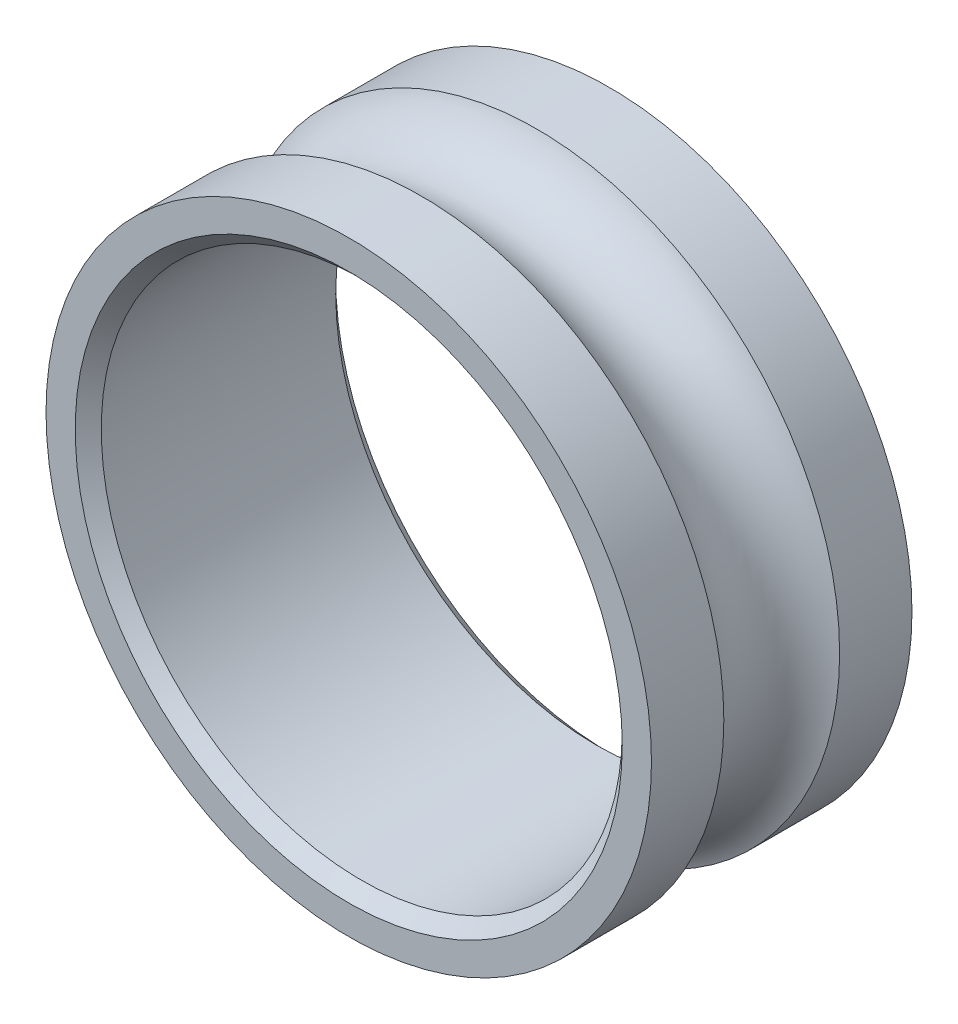
ISO-10303-21;
HEADER;
FILE_DESCRIPTION(('STEP AP214'),'2;1');
FILE_NAME('part.step','',(''),(''),'','','');
FILE_SCHEMA(('AUTOMOTIVE_DESIGN { 1 0 10303 214 1 1 1 1 }'));
ENDSEC;
DATA;
#1=APPLICATION_CONTEXT('core data for automotive mechanical design processes');
#2=APPLICATION_PROTOCOL_DEFINITION('international standard','automotive_design',2000,#1);
#3=PRODUCT_CONTEXT('',#1,'mechanical');
#4=PRODUCT('Part','Part','',(#3));
#5=PRODUCT_RELATED_PRODUCT_CATEGORY('part','',(#4));
#6=PRODUCT_DEFINITION_FORMATION('','',#4);
#7=PRODUCT_DEFINITION_CONTEXT('part definition',#1,'design');
#8=PRODUCT_DEFINITION('design','',#6,#7);
#9=PRODUCT_DEFINITION_SHAPE('','',#8);
#10=(LENGTH_UNIT() NAMED_UNIT(*) SI_UNIT(.MILLI.,.METRE.));
#11=(NAMED_UNIT(*) PLANE_ANGLE_UNIT() SI_UNIT($,.RADIAN.));
#12=(NAMED_UNIT(*) SI_UNIT($,.STERADIAN.) SOLID_ANGLE_UNIT());
#13=UNCERTAINTY_MEASURE_WITH_UNIT(LENGTH_MEASURE(1.E-05),#10,'distance_accuracy_value','');
#14=(GEOMETRIC_REPRESENTATION_CONTEXT(3) GLOBAL_UNCERTAINTY_ASSIGNED_CONTEXT((#13)) GLOBAL_UNIT_ASSIGNED_CONTEXT((#10,
#11,#12)) REPRESENTATION_CONTEXT('',''));
#15=CARTESIAN_POINT('',(0.,0.,0.));
#16=DIRECTION('',(0.,0.,1.));
#17=DIRECTION('',(1.,0.,0.));
#18=AXIS2_PLACEMENT_3D('',#15,#16,#17);
#19=CARTESIAN_POINT('',(0.,0.,0.));
#20=DIRECTION('',(0.,0.,1.));
#21=DIRECTION('',(1.,0.,0.));
#22=AXIS2_PLACEMENT_3D('',#19,#20,#21);
#23=TOROIDAL_SURFACE('',#22,3.96875,0.758760243513403);
#24=CARTESIAN_POINT('',(0.,0.,0.705555555555556));
#25=DIRECTION('',(0.,0.,1.));
#26=DIRECTION('',(1.,0.,0.));
#27=AXIS2_PLACEMENT_3D('',#24,#25,#26);
#28=CIRCLE('',#27,3.68962912087912);
#29=CARTESIAN_POINT('',(3.68962912087912,0.,0.705555555555556));
#30=VERTEX_POINT('',#29);
#31=EDGE_CURVE('E33',#30,#30,#28,.T.);
#32=ORIENTED_EDGE('',*,*,#31,.F.);
#33=EDGE_LOOP('',(#32));
#34=FACE_BOUND('',#33,.T.);
#35=CARTESIAN_POINT('',(0.,0.,-0.705555555555556));
#36=DIRECTION('',(0.,0.,1.));
#37=DIRECTION('',(1.,0.,0.));
#38=AXIS2_PLACEMENT_3D('',#35,#36,#37);
#39=CIRCLE('',#38,3.68962912087912);
#40=CARTESIAN_POINT('',(3.68962912087912,0.,-0.705555555555556));
#41=VERTEX_POINT('',#40);
#42=EDGE_CURVE('E31',#41,#41,#39,.F.);
#43=ORIENTED_EDGE('',*,*,#42,.F.);
#44=EDGE_LOOP('',(#43));
#45=FACE_BOUND('',#44,.T.);
#46=ADVANCED_FACE('F15',(#34,#45),#23,.F.);
#47=CARTESIAN_POINT('',(0.,0.,1.5875));
#48=DIRECTION('',(0.,0.,1.));
#49=DIRECTION('',(1.,0.,0.));
#50=AXIS2_PLACEMENT_3D('',#47,#48,#49);
#51=CYLINDRICAL_SURFACE('',#50,3.68962912087912);
#52=CARTESIAN_POINT('',(0.,0.,1.5875));
#53=DIRECTION('',(0.,0.,1.));
#54=DIRECTION('',(1.,0.,0.));
#55=AXIS2_PLACEMENT_3D('',#52,#53,#54);
#56=CIRCLE('',#55,3.68962912087912);
#57=CARTESIAN_POINT('',(3.68962912087912,0.,1.5875));
#58=VERTEX_POINT('',#57);
#59=EDGE_CURVE('E19',#58,#58,#56,.F.);
#60=ORIENTED_EDGE('',*,*,#59,.T.);
#61=EDGE_LOOP('',(#60));
#62=FACE_BOUND('',#61,.T.);
#63=ORIENTED_EDGE('',*,*,#31,.T.);
#64=EDGE_LOOP('',(#63));
#65=FACE_BOUND('',#64,.T.);
#66=ADVANCED_FACE('F49',(#62,#65),#51,.T.);
#67=CARTESIAN_POINT('',(0.,0.,1.5875));
#68=DIRECTION('',(0.,0.,1.));
#69=DIRECTION('',(1.,0.,0.));
#70=AXIS2_PLACEMENT_3D('',#67,#68,#69);
#71=CYLINDRICAL_SURFACE('',#70,3.68962912087912);
#72=ORIENTED_EDGE('',*,*,#42,.T.);
#73=EDGE_LOOP('',(#72));
#74=FACE_BOUND('',#73,.T.);
#75=CARTESIAN_POINT('',(0.,0.,-1.5875));
#76=DIRECTION('',(0.,0.,1.));
#77=DIRECTION('',(1.,0.,0.));
#78=AXIS2_PLACEMENT_3D('',#75,#76,#77);
#79=CIRCLE('',#78,3.68962912087912);
#80=CARTESIAN_POINT('',(3.68962912087912,0.,-1.5875));
#81=VERTEX_POINT('',#80);
#82=EDGE_CURVE('E42',#81,#81,#79,.T.);
#83=ORIENTED_EDGE('',*,*,#82,.T.);
#84=EDGE_LOOP('',(#83));
#85=FACE_BOUND('',#84,.T.);
#86=ADVANCED_FACE('F56',(#74,#85),#71,.T.);
#87=CARTESIAN_POINT('',(0.,3.68962912087912,1.5875));
#88=DIRECTION('',(0.,0.,-1.));
#89=DIRECTION('',(-1.,0.,0.));
#90=AXIS2_PLACEMENT_3D('',#87,#88,#89);
#91=PLANE('',#90);
#92=ORIENTED_EDGE('',*,*,#59,.F.);
#93=EDGE_LOOP('',(#92));
#94=FACE_BOUND('',#93,.T.);
#95=CARTESIAN_POINT('',(0.,0.,1.58750000002783));
#96=DIRECTION('',(0.,0.,1.));
#97=DIRECTION('',(1.,0.,0.));
#98=AXIS2_PLACEMENT_3D('',#95,#96,#97);
#99=CIRCLE('',#98,3.33375000002434);
#100=CARTESIAN_POINT('',(3.33375000002434,0.,1.58750000002783));
#101=VERTEX_POINT('',#100);
#102=EDGE_CURVE('E40',#101,#101,#99,.F.);
#103=ORIENTED_EDGE('',*,*,#102,.T.);
#104=EDGE_LOOP('',(#103));
#105=FACE_BOUND('',#104,.T.);
#106=ADVANCED_FACE('F52',(#94,#105),#91,.F.);
#107=CARTESIAN_POINT('',(0.,3.33375,-1.5875));
#108=DIRECTION('',(0.,0.,1.));
#109=DIRECTION('',(1.,0.,0.));
#110=AXIS2_PLACEMENT_3D('',#107,#108,#109);
#111=PLANE('',#110);
#112=CARTESIAN_POINT('',(0.,0.,-1.58749999997099));
#113=DIRECTION('',(0.,0.,-1.));
#114=DIRECTION('',(0.,1.,0.));
#115=AXIS2_PLACEMENT_3D('',#112,#113,#114);
#116=CIRCLE('',#115,3.33375000002434);
#117=CARTESIAN_POINT('',(0.,3.33375000002434,-1.58749999997099));
#118=VERTEX_POINT('',#117);
#119=EDGE_CURVE('E28',#118,#118,#116,.F.);
#120=ORIENTED_EDGE('',*,*,#119,.T.);
#121=EDGE_LOOP('',(#120));
#122=FACE_BOUND('',#121,.T.);
#123=ORIENTED_EDGE('',*,*,#82,.F.);
#124=EDGE_LOOP('',(#123));
#125=FACE_BOUND('',#124,.T.);
#126=ADVANCED_FACE('F55',(#122,#125),#111,.F.);
#127=CARTESIAN_POINT('',(0.,0.,1.58749999991414));
#128=DIRECTION('',(0.,0.,1.));
#129=DIRECTION('',(1.,0.,0.));
#130=AXIS2_PLACEMENT_3D('',#127,#128,#129);
#131=CONICAL_SURFACE('',#130,3.33374999991065,0.785398163397448);
#132=ORIENTED_EDGE('',*,*,#102,.F.);
#133=EDGE_LOOP('',(#132));
#134=FACE_BOUND('',#133,.T.);
#135=CARTESIAN_POINT('',(0.,0.,1.42875));
#136=DIRECTION('',(0.,0.,1.));
#137=DIRECTION('',(1.,0.,0.));
#138=AXIS2_PLACEMENT_3D('',#135,#136,#137);
#139=CIRCLE('',#138,3.175);
#140=CARTESIAN_POINT('',(3.175,0.,1.42875));
#141=VERTEX_POINT('',#140);
#142=EDGE_CURVE('E23',#141,#141,#139,.F.);
#143=ORIENTED_EDGE('',*,*,#142,.T.);
#144=EDGE_LOOP('',(#143));
#145=FACE_BOUND('',#144,.T.);
#146=ADVANCED_FACE('F60',(#134,#145),#131,.F.);
#147=CARTESIAN_POINT('',(0.,0.,-1.58749999997099));
#148=DIRECTION('',(0.,0.,-1.));
#149=DIRECTION('',(0.,1.,0.));
#150=AXIS2_PLACEMENT_3D('',#147,#148,#149);
#151=CONICAL_SURFACE('',#150,3.33375000002434,0.785398163397448);
#152=CARTESIAN_POINT('',(0.,0.,-1.42875));
#153=DIRECTION('',(0.,0.,1.));
#154=DIRECTION('',(1.,0.,0.));
#155=AXIS2_PLACEMENT_3D('',#152,#153,#154);
#156=CIRCLE('',#155,3.175);
#157=CARTESIAN_POINT('',(3.175,0.,-1.42875));
#158=VERTEX_POINT('',#157);
#159=EDGE_CURVE('E10',#158,#158,#156,.T.);
#160=ORIENTED_EDGE('',*,*,#159,.T.);
#161=EDGE_LOOP('',(#160));
#162=FACE_BOUND('',#161,.T.);
#163=ORIENTED_EDGE('',*,*,#119,.F.);
#164=EDGE_LOOP('',(#163));
#165=FACE_BOUND('',#164,.T.);
#166=ADVANCED_FACE('F63',(#162,#165),#151,.F.);
#167=CARTESIAN_POINT('',(0.,0.,1.5875));
#168=DIRECTION('',(0.,0.,1.));
#169=DIRECTION('',(1.,0.,0.));
#170=AXIS2_PLACEMENT_3D('',#167,#168,#169);
#171=CYLINDRICAL_SURFACE('',#170,3.175);
#172=ORIENTED_EDGE('',*,*,#142,.F.);
#173=EDGE_LOOP('',(#172));
#174=FACE_BOUND('',#173,.T.);
#175=ORIENTED_EDGE('',*,*,#159,.F.);
#176=EDGE_LOOP('',(#175));
#177=FACE_BOUND('',#176,.T.);
#178=ADVANCED_FACE('F67',(#174,#177),#171,.F.);
#179=CLOSED_SHELL('',(#46,#66,#86,#106,#126,#146,#166,#178));
#180=MANIFOLD_SOLID_BREP('B1',#179);
#181=ADVANCED_BREP_SHAPE_REPRESENTATION('',(#18,#180),#14);
#182=SHAPE_DEFINITION_REPRESENTATION(#9,#181);
ENDSEC;
END-ISO-10303-21;
